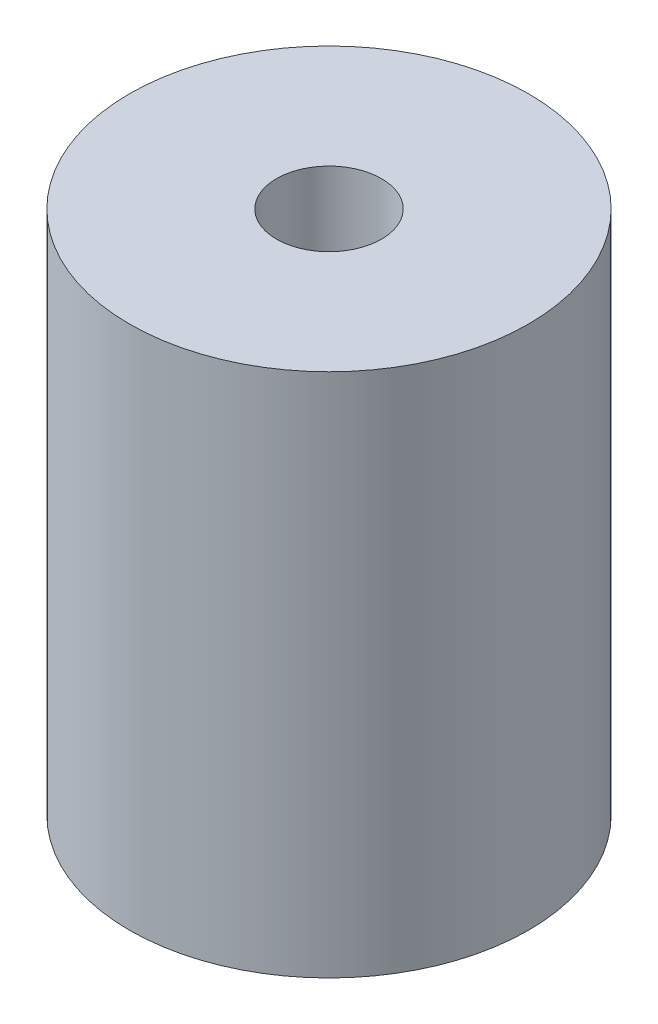
ISO-10303-21;
HEADER;
FILE_DESCRIPTION(('STEP AP214'),'2;1');
FILE_NAME('part.step','',(''),(''),'','','');
FILE_SCHEMA(('AUTOMOTIVE_DESIGN { 1 0 10303 214 1 1 1 1 }'));
ENDSEC;
DATA;
#1=APPLICATION_CONTEXT('core data for automotive mechanical design processes');
#2=APPLICATION_PROTOCOL_DEFINITION('international standard','automotive_design',2000,#1);
#3=PRODUCT_CONTEXT('',#1,'mechanical');
#4=PRODUCT('Part','Part','',(#3));
#5=PRODUCT_RELATED_PRODUCT_CATEGORY('part','',(#4));
#6=PRODUCT_DEFINITION_FORMATION('','',#4);
#7=PRODUCT_DEFINITION_CONTEXT('part definition',#1,'design');
#8=PRODUCT_DEFINITION('design','',#6,#7);
#9=PRODUCT_DEFINITION_SHAPE('','',#8);
#10=(LENGTH_UNIT() NAMED_UNIT(*) SI_UNIT(.MILLI.,.METRE.));
#11=(NAMED_UNIT(*) PLANE_ANGLE_UNIT() SI_UNIT($,.RADIAN.));
#12=(NAMED_UNIT(*) SI_UNIT($,.STERADIAN.) SOLID_ANGLE_UNIT());
#13=UNCERTAINTY_MEASURE_WITH_UNIT(LENGTH_MEASURE(1.E-05),#10,'distance_accuracy_value','');
#14=(GEOMETRIC_REPRESENTATION_CONTEXT(3) GLOBAL_UNCERTAINTY_ASSIGNED_CONTEXT((#13)) GLOBAL_UNIT_ASSIGNED_CONTEXT((#10,
#11,#12)) REPRESENTATION_CONTEXT('',''));
#15=CARTESIAN_POINT('',(0.,0.,0.));
#16=DIRECTION('',(0.,0.,1.));
#17=DIRECTION('',(1.,0.,0.));
#18=AXIS2_PLACEMENT_3D('',#15,#16,#17);
#19=CARTESIAN_POINT('',(0.,12.,0.));
#20=DIRECTION('',(0.,1.,0.));
#21=DIRECTION('',(0.,0.,1.));
#22=AXIS2_PLACEMENT_3D('',#19,#20,#21);
#23=CYLINDRICAL_SURFACE('',#22,2.5);
#24=CARTESIAN_POINT('',(0.,25.,0.));
#25=DIRECTION('',(0.,1.,0.));
#26=DIRECTION('',(0.,0.,1.));
#27=AXIS2_PLACEMENT_3D('',#24,#25,#26);
#28=CIRCLE('',#27,2.5);
#29=CARTESIAN_POINT('',(0.,25.,2.5));
#30=VERTEX_POINT('',#29);
#31=EDGE_CURVE('E52',#30,#30,#28,.T.);
#32=ORIENTED_EDGE('',*,*,#31,.T.);
#33=EDGE_LOOP('',(#32));
#34=FACE_BOUND('',#33,.T.);
#35=CARTESIAN_POINT('',(0.,13.,0.));
#36=DIRECTION('',(0.,-1.,0.));
#37=DIRECTION('',(0.,0.,-1.));
#38=AXIS2_PLACEMENT_3D('',#35,#36,#37);
#39=CIRCLE('',#38,2.5);
#40=CARTESIAN_POINT('',(0.,13.,-2.5));
#41=VERTEX_POINT('',#40);
#42=EDGE_CURVE('E41',#41,#41,#39,.F.);
#43=ORIENTED_EDGE('',*,*,#42,.F.);
#44=EDGE_LOOP('',(#43));
#45=FACE_BOUND('',#44,.T.);
#46=ADVANCED_FACE('F37',(#34,#45),#23,.F.);
#47=CARTESIAN_POINT('',(0.,25.,0.));
#48=DIRECTION('',(0.,-1.,0.));
#49=DIRECTION('',(0.,0.,-1.));
#50=AXIS2_PLACEMENT_3D('',#47,#48,#49);
#51=CYLINDRICAL_SURFACE('',#50,9.5);
#52=CARTESIAN_POINT('',(0.,25.,0.));
#53=DIRECTION('',(0.,1.,0.));
#54=DIRECTION('',(0.,0.,1.));
#55=AXIS2_PLACEMENT_3D('',#52,#53,#54);
#56=CIRCLE('',#55,9.5);
#57=CARTESIAN_POINT('',(0.,25.,9.5));
#58=VERTEX_POINT('',#57);
#59=EDGE_CURVE('E10',#58,#58,#56,.T.);
#60=ORIENTED_EDGE('',*,*,#59,.F.);
#61=EDGE_LOOP('',(#60));
#62=FACE_BOUND('',#61,.T.);
#63=CARTESIAN_POINT('',(0.,0.,0.));
#64=DIRECTION('',(0.,1.,0.));
#65=DIRECTION('',(0.,0.,1.));
#66=AXIS2_PLACEMENT_3D('',#63,#64,#65);
#67=CIRCLE('',#66,9.5);
#68=CARTESIAN_POINT('',(0.,0.,9.5));
#69=VERTEX_POINT('',#68);
#70=EDGE_CURVE('E46',#69,#69,#67,.T.);
#71=ORIENTED_EDGE('',*,*,#70,.T.);
#72=EDGE_LOOP('',(#71));
#73=FACE_BOUND('',#72,.T.);
#74=ADVANCED_FACE('F39',(#62,#73),#51,.T.);
#75=CARTESIAN_POINT('',(0.,25.,0.));
#76=DIRECTION('',(0.,1.,0.));
#77=DIRECTION('',(0.,0.,1.));
#78=AXIS2_PLACEMENT_3D('',#75,#76,#77);
#79=PLANE('',#78);
#80=ORIENTED_EDGE('',*,*,#31,.F.);
#81=EDGE_LOOP('',(#80));
#82=FACE_BOUND('',#81,.T.);
#83=ORIENTED_EDGE('',*,*,#59,.T.);
#84=EDGE_LOOP('',(#83));
#85=FACE_BOUND('',#84,.T.);
#86=ADVANCED_FACE('F78',(#82,#85),#79,.T.);
#87=CARTESIAN_POINT('',(0.,0.,0.));
#88=DIRECTION('',(0.,1.,0.));
#89=DIRECTION('',(0.,0.,1.));
#90=AXIS2_PLACEMENT_3D('',#87,#88,#89);
#91=PLANE('',#90);
#92=CARTESIAN_POINT('',(0.,0.,0.));
#93=DIRECTION('',(0.,-1.,0.));
#94=DIRECTION('',(0.,0.,-1.));
#95=AXIS2_PLACEMENT_3D('',#92,#93,#94);
#96=CIRCLE('',#95,4.);
#97=CARTESIAN_POINT('',(0.,0.,-4.));
#98=VERTEX_POINT('',#97);
#99=EDGE_CURVE('E57',#98,#98,#96,.T.);
#100=ORIENTED_EDGE('',*,*,#99,.F.);
#101=EDGE_LOOP('',(#100));
#102=FACE_BOUND('',#101,.T.);
#103=ORIENTED_EDGE('',*,*,#70,.F.);
#104=EDGE_LOOP('',(#103));
#105=FACE_BOUND('',#104,.T.);
#106=ADVANCED_FACE('F85',(#102,#105),#91,.F.);
#107=CARTESIAN_POINT('',(0.,13.,0.));
#108=DIRECTION('',(0.,-1.,0.));
#109=DIRECTION('',(0.,0.,-1.));
#110=AXIS2_PLACEMENT_3D('',#107,#108,#109);
#111=PLANE('',#110);
#112=CARTESIAN_POINT('',(0.,13.,0.));
#113=DIRECTION('',(0.,-1.,0.));
#114=DIRECTION('',(0.,0.,-1.));
#115=AXIS2_PLACEMENT_3D('',#112,#113,#114);
#116=CIRCLE('',#115,4.);
#117=CARTESIAN_POINT('',(0.,13.,-4.));
#118=VERTEX_POINT('',#117);
#119=EDGE_CURVE('E61',#118,#118,#116,.T.);
#120=ORIENTED_EDGE('',*,*,#119,.T.);
#121=EDGE_LOOP('',(#120));
#122=FACE_BOUND('',#121,.T.);
#123=ORIENTED_EDGE('',*,*,#42,.T.);
#124=EDGE_LOOP('',(#123));
#125=FACE_BOUND('',#124,.T.);
#126=ADVANCED_FACE('F70',(#122,#125),#111,.T.);
#127=CARTESIAN_POINT('',(0.,13.,0.));
#128=DIRECTION('',(0.,-1.,0.));
#129=DIRECTION('',(0.,0.,-1.));
#130=AXIS2_PLACEMENT_3D('',#127,#128,#129);
#131=CYLINDRICAL_SURFACE('',#130,4.);
#132=ORIENTED_EDGE('',*,*,#119,.F.);
#133=EDGE_LOOP('',(#132));
#134=FACE_BOUND('',#133,.T.);
#135=ORIENTED_EDGE('',*,*,#99,.T.);
#136=EDGE_LOOP('',(#135));
#137=FACE_BOUND('',#136,.T.);
#138=ADVANCED_FACE('F82',(#134,#137),#131,.F.);
#139=CLOSED_SHELL('',(#46,#74,#86,#106,#126,#138));
#140=MANIFOLD_SOLID_BREP('B2',#139);
#141=ADVANCED_BREP_SHAPE_REPRESENTATION('',(#18,#140),#14);
#142=SHAPE_DEFINITION_REPRESENTATION(#9,#141);
ENDSEC;
END-ISO-10303-21;
